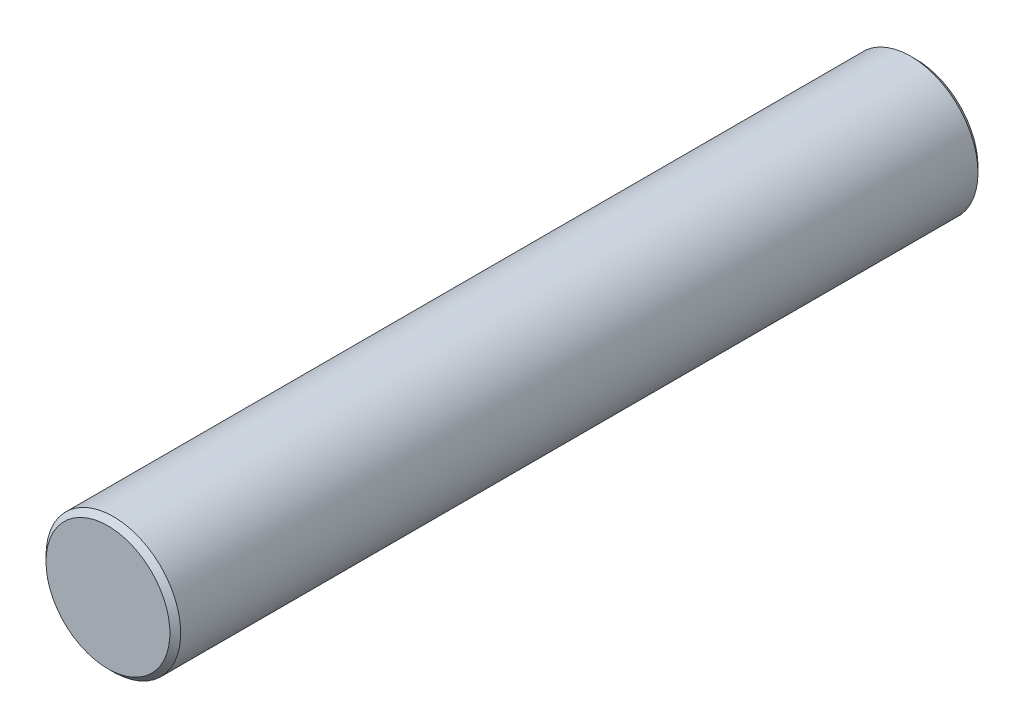
ISO-10303-21;
HEADER;
FILE_DESCRIPTION(('STEP AP214'),'2;1');
FILE_NAME('part.step','',(''),(''),'','','');
FILE_SCHEMA(('AUTOMOTIVE_DESIGN { 1 0 10303 214 1 1 1 1 }'));
ENDSEC;
DATA;
#1=APPLICATION_CONTEXT('core data for automotive mechanical design processes');
#2=APPLICATION_PROTOCOL_DEFINITION('international standard','automotive_design',2000,#1);
#3=PRODUCT_CONTEXT('',#1,'mechanical');
#4=PRODUCT('Part','Part','',(#3));
#5=PRODUCT_RELATED_PRODUCT_CATEGORY('part','',(#4));
#6=PRODUCT_DEFINITION_FORMATION('','',#4);
#7=PRODUCT_DEFINITION_CONTEXT('part definition',#1,'design');
#8=PRODUCT_DEFINITION('design','',#6,#7);
#9=PRODUCT_DEFINITION_SHAPE('','',#8);
#10=(LENGTH_UNIT() NAMED_UNIT(*) SI_UNIT(.MILLI.,.METRE.));
#11=(NAMED_UNIT(*) PLANE_ANGLE_UNIT() SI_UNIT($,.RADIAN.));
#12=(NAMED_UNIT(*) SI_UNIT($,.STERADIAN.) SOLID_ANGLE_UNIT());
#13=UNCERTAINTY_MEASURE_WITH_UNIT(LENGTH_MEASURE(1.E-05),#10,'distance_accuracy_value','');
#14=(GEOMETRIC_REPRESENTATION_CONTEXT(3) GLOBAL_UNCERTAINTY_ASSIGNED_CONTEXT((#13)) GLOBAL_UNIT_ASSIGNED_CONTEXT((#10,
#11,#12)) REPRESENTATION_CONTEXT('',''));
#15=CARTESIAN_POINT('',(0.,0.,0.));
#16=DIRECTION('',(0.,0.,1.));
#17=DIRECTION('',(1.,0.,0.));
#18=AXIS2_PLACEMENT_3D('',#15,#16,#17);
#19=CARTESIAN_POINT('',(0.,0.,95.25));
#20=DIRECTION('',(0.,0.,-1.));
#21=DIRECTION('',(-1.,0.,0.));
#22=AXIS2_PLACEMENT_3D('',#19,#20,#21);
#23=CYLINDRICAL_SURFACE('',#22,7.9375);
#24=CARTESIAN_POINT('',(0.,0.,0.635000000000024));
#25=DIRECTION('',(0.,0.,1.));
#26=DIRECTION('',(1.,0.,0.));
#27=AXIS2_PLACEMENT_3D('',#24,#25,#26);
#28=CIRCLE('',#27,7.9375);
#29=CARTESIAN_POINT('',(7.9375,0.,0.635000000000024));
#30=VERTEX_POINT('',#29);
#31=EDGE_CURVE('E47',#30,#30,#28,.T.);
#32=ORIENTED_EDGE('',*,*,#31,.T.);
#33=EDGE_LOOP('',(#32));
#34=FACE_BOUND('',#33,.T.);
#35=CARTESIAN_POINT('',(0.,0.,94.615));
#36=DIRECTION('',(0.,0.,1.));
#37=DIRECTION('',(1.,0.,0.));
#38=AXIS2_PLACEMENT_3D('',#35,#36,#37);
#39=CIRCLE('',#38,7.9375);
#40=CARTESIAN_POINT('',(-7.93750000000001,0.,94.615));
#41=VERTEX_POINT('',#40);
#42=EDGE_CURVE('E51',#41,#41,#39,.F.);
#43=ORIENTED_EDGE('',*,*,#42,.T.);
#44=EDGE_LOOP('',(#43));
#45=FACE_BOUND('',#44,.T.);
#46=ADVANCED_FACE('F35',(#34,#45),#23,.T.);
#47=CARTESIAN_POINT('',(0.,0.,95.25));
#48=DIRECTION('',(0.,0.,1.));
#49=DIRECTION('',(1.,0.,0.));
#50=AXIS2_PLACEMENT_3D('',#47,#48,#49);
#51=PLANE('',#50);
#52=CARTESIAN_POINT('',(0.,0.,95.25));
#53=DIRECTION('',(0.,0.,1.));
#54=DIRECTION('',(1.,0.,0.));
#55=AXIS2_PLACEMENT_3D('',#52,#53,#54);
#56=CIRCLE('',#55,7.30250000000002);
#57=CARTESIAN_POINT('',(-7.30250000000002,0.,95.25));
#58=VERTEX_POINT('',#57);
#59=EDGE_CURVE('E10',#58,#58,#56,.T.);
#60=ORIENTED_EDGE('',*,*,#59,.T.);
#61=EDGE_LOOP('',(#60));
#62=FACE_BOUND('',#61,.T.);
#63=ADVANCED_FACE('F67',(#62),#51,.T.);
#64=CARTESIAN_POINT('',(0.,0.,0.));
#65=DIRECTION('',(0.,0.,1.));
#66=DIRECTION('',(1.,0.,0.));
#67=AXIS2_PLACEMENT_3D('',#64,#65,#66);
#68=PLANE('',#67);
#69=CARTESIAN_POINT('',(0.,0.,0.));
#70=DIRECTION('',(0.,0.,1.));
#71=DIRECTION('',(1.,0.,0.));
#72=AXIS2_PLACEMENT_3D('',#69,#70,#71);
#73=CIRCLE('',#72,7.30249999999998);
#74=CARTESIAN_POINT('',(7.30249999999998,0.,0.));
#75=VERTEX_POINT('',#74);
#76=EDGE_CURVE('E43',#75,#75,#73,.F.);
#77=ORIENTED_EDGE('',*,*,#76,.T.);
#78=EDGE_LOOP('',(#77));
#79=FACE_BOUND('',#78,.T.);
#80=ADVANCED_FACE('F64',(#79),#68,.F.);
#81=CARTESIAN_POINT('',(0.,0.,0.635000000000024));
#82=DIRECTION('',(0.,0.,1.));
#83=DIRECTION('',(1.,0.,0.));
#84=AXIS2_PLACEMENT_3D('',#81,#82,#83);
#85=CONICAL_SURFACE('',#84,7.9375,0.785398163397448);
#86=ORIENTED_EDGE('',*,*,#76,.F.);
#87=EDGE_LOOP('',(#86));
#88=FACE_BOUND('',#87,.T.);
#89=ORIENTED_EDGE('',*,*,#31,.F.);
#90=EDGE_LOOP('',(#89));
#91=FACE_BOUND('',#90,.T.);
#92=ADVANCED_FACE('F60',(#88,#91),#85,.T.);
#93=CARTESIAN_POINT('',(0.,0.,95.25));
#94=DIRECTION('',(0.,0.,-1.));
#95=DIRECTION('',(-1.,0.,0.));
#96=AXIS2_PLACEMENT_3D('',#93,#94,#95);
#97=CONICAL_SURFACE('',#96,7.30250000000002,0.785398163397448);
#98=CARTESIAN_POINT('',(-7.93750000000001,0.,94.615));
#99=CARTESIAN_POINT('',(-7.93088541666667,0.,94.6216145833333));
#100=CARTESIAN_POINT('',(-7.92427083333334,0.,94.6282291666667));
#101=CARTESIAN_POINT('',(-7.91104166666667,0.,94.6414583333333));
#102=CARTESIAN_POINT('',(-7.90442708333334,0.,94.6480729166667));
#103=CARTESIAN_POINT('',(-7.89119791666667,0.,94.6613020833333));
#104=CARTESIAN_POINT('',(-7.88458333333334,0.,94.6679166666667));
#105=CARTESIAN_POINT('',(-7.87135416666668,0.,94.6811458333333));
#106=CARTESIAN_POINT('',(-7.86473958333334,0.,94.6877604166667));
#107=CARTESIAN_POINT('',(-7.85151041666668,0.,94.7009895833333));
#108=CARTESIAN_POINT('',(-7.84489583333334,0.,94.7076041666667));
#109=CARTESIAN_POINT('',(-7.83166666666668,0.,94.7208333333333));
#110=CARTESIAN_POINT('',(-7.82505208333334,0.,94.7274479166667));
#111=CARTESIAN_POINT('',(-7.81182291666668,0.,94.7406770833333));
#112=CARTESIAN_POINT('',(-7.80520833333334,0.,94.7472916666667));
#113=CARTESIAN_POINT('',(-7.79197916666668,0.,94.7605208333333));
#114=CARTESIAN_POINT('',(-7.78536458333334,0.,94.7671354166667));
#115=CARTESIAN_POINT('',(-7.77213541666668,0.,94.7803645833333));
#116=CARTESIAN_POINT('',(-7.76552083333334,0.,94.7869791666667));
#117=CARTESIAN_POINT('',(-7.75229166666668,0.,94.8002083333333));
#118=CARTESIAN_POINT('',(-7.74567708333334,0.,94.8068229166667));
#119=CARTESIAN_POINT('',(-7.73244791666668,0.,94.8200520833333));
#120=CARTESIAN_POINT('',(-7.72583333333335,0.,94.8266666666667));
#121=CARTESIAN_POINT('',(-7.71260416666668,0.,94.8398958333333));
#122=CARTESIAN_POINT('',(-7.70598958333335,0.,94.8465104166667));
#123=CARTESIAN_POINT('',(-7.69276041666668,0.,94.8597395833333));
#124=CARTESIAN_POINT('',(-7.68614583333335,0.,94.8663541666667));
#125=CARTESIAN_POINT('',(-7.67291666666668,0.,94.8795833333333));
#126=CARTESIAN_POINT('',(-7.66630208333335,0.,94.8861979166667));
#127=CARTESIAN_POINT('',(-7.65307291666668,0.,94.8994270833333));
#128=CARTESIAN_POINT('',(-7.64645833333335,0.,94.9060416666667));
#129=CARTESIAN_POINT('',(-7.63322916666668,0.,94.9192708333333));
#130=CARTESIAN_POINT('',(-7.62661458333335,0.,94.9258854166667));
#131=CARTESIAN_POINT('',(-7.61338541666668,0.,94.9391145833333));
#132=CARTESIAN_POINT('',(-7.60677083333335,0.,94.9457291666667));
#133=CARTESIAN_POINT('',(-7.59354166666668,0.,94.9589583333333));
#134=CARTESIAN_POINT('',(-7.58692708333335,0.,94.9655729166667));
#135=CARTESIAN_POINT('',(-7.57369791666668,0.,94.9788020833333));
#136=CARTESIAN_POINT('',(-7.56708333333335,0.,94.9854166666667));
#137=CARTESIAN_POINT('',(-7.55385416666668,0.,94.9986458333333));
#138=CARTESIAN_POINT('',(-7.54723958333335,0.,95.0052604166667));
#139=CARTESIAN_POINT('',(-7.53401041666668,0.,95.0184895833333));
#140=CARTESIAN_POINT('',(-7.52739583333335,0.,95.0251041666667));
#141=CARTESIAN_POINT('',(-7.51416666666668,0.,95.0383333333333));
#142=CARTESIAN_POINT('',(-7.50755208333335,0.,95.0449479166667));
#143=CARTESIAN_POINT('',(-7.49432291666669,0.,95.0581770833333));
#144=CARTESIAN_POINT('',(-7.48770833333335,0.,95.0647916666667));
#145=CARTESIAN_POINT('',(-7.47447916666669,0.,95.0780208333333));
#146=CARTESIAN_POINT('',(-7.46786458333335,0.,95.0846354166667));
#147=CARTESIAN_POINT('',(-7.45463541666669,0.,95.0978645833333));
#148=CARTESIAN_POINT('',(-7.44802083333335,0.,95.1044791666667));
#149=CARTESIAN_POINT('',(-7.43479166666669,0.,95.1177083333333));
#150=CARTESIAN_POINT('',(-7.42817708333335,0.,95.1243229166667));
#151=CARTESIAN_POINT('',(-7.41494791666669,0.,95.1375520833333));
#152=CARTESIAN_POINT('',(-7.40833333333336,0.,95.1441666666667));
#153=CARTESIAN_POINT('',(-7.39510416666669,0.,95.1573958333333));
#154=CARTESIAN_POINT('',(-7.38848958333336,0.,95.1640104166667));
#155=CARTESIAN_POINT('',(-7.37526041666669,0.,95.1772395833333));
#156=CARTESIAN_POINT('',(-7.36864583333336,0.,95.1838541666667));
#157=CARTESIAN_POINT('',(-7.35541666666669,0.,95.1970833333333));
#158=CARTESIAN_POINT('',(-7.34880208333336,0.,95.2036979166667));
#159=CARTESIAN_POINT('',(-7.33557291666669,0.,95.2169270833333));
#160=CARTESIAN_POINT('',(-7.32895833333336,0.,95.2235416666667));
#161=CARTESIAN_POINT('',(-7.31572916666669,0.,95.2367708333333));
#162=CARTESIAN_POINT('',(-7.30911458333336,0.,95.2433854166667));
#163=CARTESIAN_POINT('',(-7.30250000000002,0.,95.25));
#164=B_SPLINE_CURVE_WITH_KNOTS('',3,(#98,#99,#100,#101,#102,#103,#104,#105,#106,#107,#108,#109,
#110,#111,#112,#113,#114,#115,#116,#117,#118,#119,#120,#121,#122,#123,#124,#125,#126,#127,#128,
#129,#130,#131,#132,#133,#134,#135,#136,#137,#138,#139,#140,#141,#142,#143,#144,#145,#146,#147,
#148,#149,#150,#151,#152,#153,#154,#155,#156,#157,#158,#159,#160,#161,#162,#163),.UNSPECIFIED.,
.F.,.F.,(4,2,2,2,2,2,2,2,2,2,2,2,2,2,2,2,2,2,2,2,2,2,2,2,2,2,2,2,2,2,2,2,4),(0.,
0.0280633003783397,0.0561266007566795,0.084189901135018,0.112253201513358,0.140316501891697,
0.168379802270036,0.196443102648376,0.224506403026715,0.252569703405055,0.280633003783394,
0.308696304161743,0.336759604540083,0.364822904918423,0.392886205296762,0.420949505675101,
0.449012806053441,0.47707610643178,0.505139406810119,0.533202707188459,0.561266007566798,
0.589329307945138,0.617392608323487,0.645455908701826,0.673519209080166,0.701582509458506,
0.729645809836845,0.757709110215184,0.785772410593524,0.813835710971863,0.841899011350203,
0.869962311728542,0.898025612106891),.UNSPECIFIED.);
#165=EDGE_CURVE('BSEAM38',#41,#58,#164,.T.);
#166=ORIENTED_EDGE('',*,*,#42,.F.);
#167=ORIENTED_EDGE('',*,*,#59,.F.);
#168=ORIENTED_EDGE('',*,*,#165,.T.);
#169=ORIENTED_EDGE('',*,*,#165,.F.);
#170=EDGE_LOOP('',(#166,#168,#167,#169));
#171=FACE_BOUND('',#170,.T.);
#172=ADVANCED_FACE('F38',(#171),#97,.T.);
#173=CLOSED_SHELL('',(#46,#63,#80,#92,#172));
#174=MANIFOLD_SOLID_BREP('B2',#173);
#175=ADVANCED_BREP_SHAPE_REPRESENTATION('',(#18,#174),#14);
#176=SHAPE_DEFINITION_REPRESENTATION(#9,#175);
ENDSEC;
END-ISO-10303-21;
